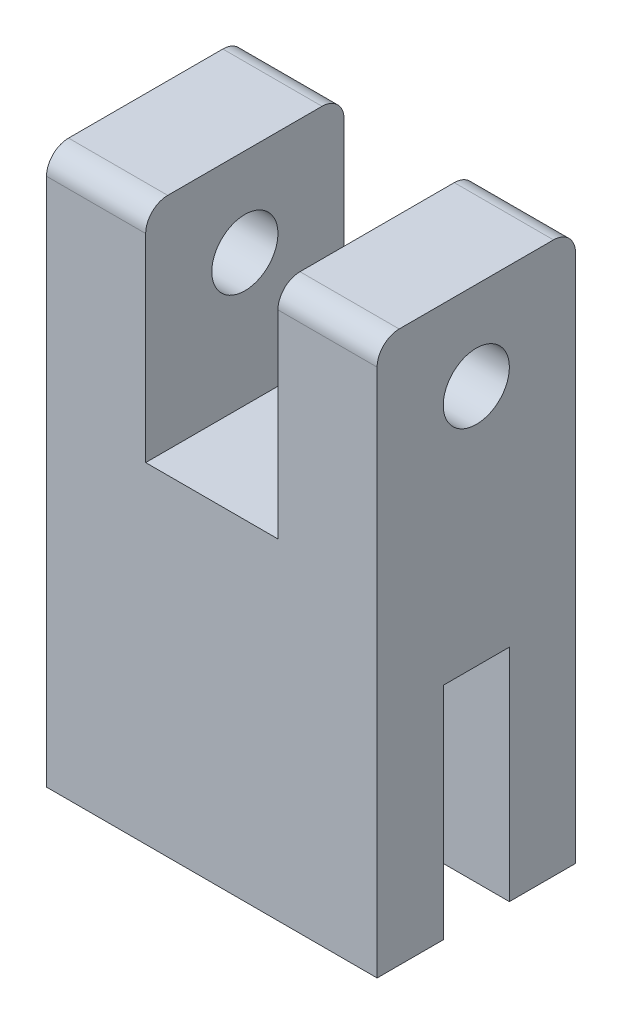
ISO-10303-21;
HEADER;
FILE_DESCRIPTION(('STEP AP214'),'2;1');
FILE_NAME('part.step','',(''),(''),'','','');
FILE_SCHEMA(('AUTOMOTIVE_DESIGN { 1 0 10303 214 1 1 1 1 }'));
ENDSEC;
DATA;
#1=APPLICATION_CONTEXT('core data for automotive mechanical design processes');
#2=APPLICATION_PROTOCOL_DEFINITION('international standard','automotive_design',2000,#1);
#3=PRODUCT_CONTEXT('',#1,'mechanical');
#4=PRODUCT('Part','Part','',(#3));
#5=PRODUCT_RELATED_PRODUCT_CATEGORY('part','',(#4));
#6=PRODUCT_DEFINITION_FORMATION('','',#4);
#7=PRODUCT_DEFINITION_CONTEXT('part definition',#1,'design');
#8=PRODUCT_DEFINITION('design','',#6,#7);
#9=PRODUCT_DEFINITION_SHAPE('','',#8);
#10=(LENGTH_UNIT() NAMED_UNIT(*) SI_UNIT(.MILLI.,.METRE.));
#11=(NAMED_UNIT(*) PLANE_ANGLE_UNIT() SI_UNIT($,.RADIAN.));
#12=(NAMED_UNIT(*) SI_UNIT($,.STERADIAN.) SOLID_ANGLE_UNIT());
#13=UNCERTAINTY_MEASURE_WITH_UNIT(LENGTH_MEASURE(1.E-05),#10,'distance_accuracy_value','');
#14=(GEOMETRIC_REPRESENTATION_CONTEXT(3) GLOBAL_UNCERTAINTY_ASSIGNED_CONTEXT((#13)) GLOBAL_UNIT_ASSIGNED_CONTEXT((#10,
#11,#12)) REPRESENTATION_CONTEXT('',''));
#15=CARTESIAN_POINT('',(0.,0.,0.));
#16=DIRECTION('',(0.,0.,1.));
#17=DIRECTION('',(1.,0.,0.));
#18=AXIS2_PLACEMENT_3D('',#15,#16,#17);
#19=CARTESIAN_POINT('',(-7.5,7.5,4.5));
#20=DIRECTION('',(0.,-1.,0.));
#21=DIRECTION('',(0.,0.,-1.));
#22=AXIS2_PLACEMENT_3D('',#19,#20,#21);
#23=PLANE('',#22);
#24=DIRECTION('',(0.,0.,-1.));
#25=VECTOR('',#24,1.);
#26=CARTESIAN_POINT('',(-3.,7.5,-4.5));
#27=LINE('',#26,#25);
#28=CARTESIAN_POINT('',(-3.,7.5,4.5));
#29=VERTEX_POINT('',#28);
#30=CARTESIAN_POINT('',(-3.,7.5,-4.5));
#31=VERTEX_POINT('',#30);
#32=EDGE_CURVE('E193',#29,#31,#27,.T.);
#33=ORIENTED_EDGE('',*,*,#32,.F.);
#34=DIRECTION('',(-1.,0.,0.));
#35=VECTOR('',#34,1.);
#36=CARTESIAN_POINT('',(-7.5,7.5,4.5));
#37=LINE('',#36,#35);
#38=CARTESIAN_POINT('',(3.,7.5,4.5));
#39=VERTEX_POINT('',#38);
#40=EDGE_CURVE('E177',#39,#29,#37,.T.);
#41=ORIENTED_EDGE('',*,*,#40,.F.);
#42=DIRECTION('',(0.,0.,1.));
#43=VECTOR('',#42,1.);
#44=CARTESIAN_POINT('',(3.,7.5,-4.5));
#45=LINE('',#44,#43);
#46=CARTESIAN_POINT('',(3.,7.5,-4.5));
#47=VERTEX_POINT('',#46);
#48=EDGE_CURVE('E190',#47,#39,#45,.T.);
#49=ORIENTED_EDGE('',*,*,#48,.F.);
#50=DIRECTION('',(-1.,0.,0.));
#51=VECTOR('',#50,1.);
#52=CARTESIAN_POINT('',(-7.5,7.5,-4.5));
#53=LINE('',#52,#51);
#54=EDGE_CURVE('E262',#47,#31,#53,.T.);
#55=ORIENTED_EDGE('',*,*,#54,.T.);
#56=EDGE_LOOP('',(#33,#41,#49,#55));
#57=FACE_BOUND('',#56,.T.);
#58=ADVANCED_FACE('F33',(#57),#23,.F.);
#59=CARTESIAN_POINT('',(-7.5,-7.5,4.5));
#60=DIRECTION('',(0.,1.,0.));
#61=DIRECTION('',(0.,0.,1.));
#62=AXIS2_PLACEMENT_3D('',#59,#60,#61);
#63=PLANE('',#62);
#64=DIRECTION('',(1.,0.,0.));
#65=VECTOR('',#64,1.);
#66=CARTESIAN_POINT('',(-7.5,-7.5,-1.5));
#67=LINE('',#66,#65);
#68=CARTESIAN_POINT('',(1.5,-7.5,-1.5));
#69=VERTEX_POINT('',#68);
#70=CARTESIAN_POINT('',(7.5,-7.5,-1.5));
#71=VERTEX_POINT('',#70);
#72=EDGE_CURVE('E232',#69,#71,#67,.T.);
#73=ORIENTED_EDGE('',*,*,#72,.F.);
#74=DIRECTION('',(0.,0.,1.));
#75=VECTOR('',#74,1.);
#76=CARTESIAN_POINT('',(1.5,-7.5,-4.5));
#77=LINE('',#76,#75);
#78=CARTESIAN_POINT('',(1.5,-7.5,-4.5));
#79=VERTEX_POINT('',#78);
#80=EDGE_CURVE('E224',#79,#69,#77,.T.);
#81=ORIENTED_EDGE('',*,*,#80,.F.);
#82=DIRECTION('',(1.,0.,0.));
#83=VECTOR('',#82,1.);
#84=CARTESIAN_POINT('',(-7.5,-7.5,-4.5));
#85=LINE('',#84,#83);
#86=CARTESIAN_POINT('',(7.5,-7.5,-4.5));
#87=VERTEX_POINT('',#86);
#88=EDGE_CURVE('E266',#79,#87,#85,.T.);
#89=ORIENTED_EDGE('',*,*,#88,.T.);
#90=DIRECTION('',(0.,0.,-1.));
#91=VECTOR('',#90,1.);
#92=CARTESIAN_POINT('',(7.5,-7.5,4.5));
#93=LINE('',#92,#91);
#94=EDGE_CURVE('E194',#71,#87,#93,.T.);
#95=ORIENTED_EDGE('',*,*,#94,.F.);
#96=EDGE_LOOP('',(#73,#81,#89,#95));
#97=FACE_BOUND('',#96,.T.);
#98=ADVANCED_FACE('F409',(#97),#63,.F.);
#99=CARTESIAN_POINT('',(-7.5,7.5,4.5));
#100=DIRECTION('',(1.,0.,0.));
#101=DIRECTION('',(0.,0.,-1.));
#102=AXIS2_PLACEMENT_3D('',#99,#100,#101);
#103=PLANE('',#102);
#104=CARTESIAN_POINT('',(-7.5,13.5,0.));
#105=DIRECTION('',(1.,0.,0.));
#106=DIRECTION('',(0.,0.,-1.));
#107=AXIS2_PLACEMENT_3D('',#104,#105,#106);
#108=CIRCLE('',#107,1.5);
#109=CARTESIAN_POINT('',(-7.5,13.5,-1.5));
#110=VERTEX_POINT('',#109);
#111=EDGE_CURVE('E293',#110,#110,#108,.T.);
#112=ORIENTED_EDGE('',*,*,#111,.T.);
#113=EDGE_LOOP('',(#112));
#114=FACE_BOUND('',#113,.T.);
#115=DIRECTION('',(0.,-1.,0.));
#116=VECTOR('',#115,1.);
#117=CARTESIAN_POINT('',(-7.5,7.5,4.5));
#118=LINE('',#117,#116);
#119=CARTESIAN_POINT('',(-7.5,16.5,4.5));
#120=VERTEX_POINT('',#119);
#121=CARTESIAN_POINT('',(-7.5,-7.5,4.5));
#122=VERTEX_POINT('',#121);
#123=EDGE_CURVE('E259',#120,#122,#118,.T.);
#124=ORIENTED_EDGE('',*,*,#123,.F.);
#125=CARTESIAN_POINT('',(-7.5,16.5,3.5));
#126=DIRECTION('',(1.,0.,0.));
#127=DIRECTION('',(0.,0.,-1.));
#128=AXIS2_PLACEMENT_3D('',#125,#126,#127);
#129=CIRCLE('',#128,1.);
#130=CARTESIAN_POINT('',(-7.5,17.5,3.5));
#131=VERTEX_POINT('',#130);
#132=EDGE_CURVE('E11',#120,#131,#129,.F.);
#133=ORIENTED_EDGE('',*,*,#132,.T.);
#134=DIRECTION('',(0.,0.,1.));
#135=VECTOR('',#134,1.);
#136=CARTESIAN_POINT('',(-7.5,17.5,-4.5));
#137=LINE('',#136,#135);
#138=CARTESIAN_POINT('',(-7.5,17.5,-3.5));
#139=VERTEX_POINT('',#138);
#140=EDGE_CURVE('E328',#139,#131,#137,.T.);
#141=ORIENTED_EDGE('',*,*,#140,.F.);
#142=CARTESIAN_POINT('',(-7.5,16.5,-3.5));
#143=DIRECTION('',(1.,0.,0.));
#144=DIRECTION('',(0.,0.,-1.));
#145=AXIS2_PLACEMENT_3D('',#142,#143,#144);
#146=CIRCLE('',#145,1.);
#147=CARTESIAN_POINT('',(-7.5,16.5,-4.5));
#148=VERTEX_POINT('',#147);
#149=EDGE_CURVE('E41',#139,#148,#146,.F.);
#150=ORIENTED_EDGE('',*,*,#149,.T.);
#151=DIRECTION('',(0.,-1.,0.));
#152=VECTOR('',#151,1.);
#153=CARTESIAN_POINT('',(-7.5,7.5,-4.5));
#154=LINE('',#153,#152);
#155=CARTESIAN_POINT('',(-7.5,-7.5,-4.5));
#156=VERTEX_POINT('',#155);
#157=EDGE_CURVE('E256',#148,#156,#154,.T.);
#158=ORIENTED_EDGE('',*,*,#157,.T.);
#159=DIRECTION('',(0.,0.,-1.));
#160=VECTOR('',#159,1.);
#161=CARTESIAN_POINT('',(-7.5,-7.5,4.5));
#162=LINE('',#161,#160);
#163=CARTESIAN_POINT('',(-7.5,-7.5,-1.5));
#164=VERTEX_POINT('',#163);
#165=EDGE_CURVE('E277',#164,#156,#162,.T.);
#166=ORIENTED_EDGE('',*,*,#165,.F.);
#167=DIRECTION('',(0.,-1.,0.));
#168=VECTOR('',#167,1.);
#169=CARTESIAN_POINT('',(-7.5,2.5,-1.5));
#170=LINE('',#169,#168);
#171=CARTESIAN_POINT('',(-7.5,2.5,-1.5));
#172=VERTEX_POINT('',#171);
#173=EDGE_CURVE('E230',#172,#164,#170,.T.);
#174=ORIENTED_EDGE('',*,*,#173,.F.);
#175=DIRECTION('',(0.,0.,1.));
#176=VECTOR('',#175,1.);
#177=CARTESIAN_POINT('',(-7.5,2.5,-1.5));
#178=LINE('',#177,#176);
#179=CARTESIAN_POINT('',(-7.5,2.5,1.5));
#180=VERTEX_POINT('',#179);
#181=EDGE_CURVE('E253',#172,#180,#178,.T.);
#182=ORIENTED_EDGE('',*,*,#181,.T.);
#183=DIRECTION('',(0.,-1.,0.));
#184=VECTOR('',#183,1.);
#185=CARTESIAN_POINT('',(-7.5,2.5,1.5));
#186=LINE('',#185,#184);
#187=CARTESIAN_POINT('',(-7.5,-7.5,1.5));
#188=VERTEX_POINT('',#187);
#189=EDGE_CURVE('E223',#180,#188,#186,.T.);
#190=ORIENTED_EDGE('',*,*,#189,.T.);
#191=EDGE_CURVE('E278',#122,#188,#162,.T.);
#192=ORIENTED_EDGE('',*,*,#191,.F.);
#193=EDGE_LOOP('',(#124,#133,#141,#150,#158,#166,#174,#182,#190,#192));
#194=FACE_BOUND('',#193,.T.);
#195=ADVANCED_FACE('F324',(#114,#194),#103,.F.);
#196=CARTESIAN_POINT('',(-1.5,-7.5,-4.5));
#197=VERTEX_POINT('',#196);
#198=EDGE_CURVE('E267',#156,#197,#85,.T.);
#199=ORIENTED_EDGE('',*,*,#198,.T.);
#200=DIRECTION('',(0.,0.,1.));
#201=VECTOR('',#200,1.);
#202=CARTESIAN_POINT('',(-1.5,-7.5,-4.5));
#203=LINE('',#202,#201);
#204=CARTESIAN_POINT('',(-1.5,-7.5,-1.5));
#205=VERTEX_POINT('',#204);
#206=EDGE_CURVE('E226',#197,#205,#203,.T.);
#207=ORIENTED_EDGE('',*,*,#206,.T.);
#208=EDGE_CURVE('E234',#164,#205,#67,.T.);
#209=ORIENTED_EDGE('',*,*,#208,.F.);
#210=ORIENTED_EDGE('',*,*,#165,.T.);
#211=EDGE_LOOP('',(#199,#207,#209,#210));
#212=FACE_BOUND('',#211,.T.);
#213=ADVANCED_FACE('F360',(#212),#63,.F.);
#214=CARTESIAN_POINT('',(7.5,7.5,4.5));
#215=DIRECTION('',(-1.,0.,0.));
#216=DIRECTION('',(0.,0.,1.));
#217=AXIS2_PLACEMENT_3D('',#214,#215,#216);
#218=PLANE('',#217);
#219=CARTESIAN_POINT('',(7.5,13.5,0.));
#220=DIRECTION('',(1.,0.,0.));
#221=DIRECTION('',(0.,0.,-1.));
#222=AXIS2_PLACEMENT_3D('',#219,#220,#221);
#223=CIRCLE('',#222,1.5);
#224=CARTESIAN_POINT('',(7.5,13.5,-1.5));
#225=VERTEX_POINT('',#224);
#226=EDGE_CURVE('E349',#225,#225,#223,.T.);
#227=ORIENTED_EDGE('',*,*,#226,.F.);
#228=EDGE_LOOP('',(#227));
#229=FACE_BOUND('',#228,.T.);
#230=DIRECTION('',(0.,1.,0.));
#231=VECTOR('',#230,1.);
#232=CARTESIAN_POINT('',(7.5,7.5,-4.5));
#233=LINE('',#232,#231);
#234=CARTESIAN_POINT('',(7.5,16.5,-4.5));
#235=VERTEX_POINT('',#234);
#236=EDGE_CURVE('E270',#87,#235,#233,.T.);
#237=ORIENTED_EDGE('',*,*,#236,.T.);
#238=CARTESIAN_POINT('',(7.5,16.5,-3.5));
#239=DIRECTION('',(-1.,0.,0.));
#240=DIRECTION('',(0.,0.,1.));
#241=AXIS2_PLACEMENT_3D('',#238,#239,#240);
#242=CIRCLE('',#241,1.);
#243=CARTESIAN_POINT('',(7.5,17.5,-3.5));
#244=VERTEX_POINT('',#243);
#245=EDGE_CURVE('E309',#235,#244,#242,.F.);
#246=ORIENTED_EDGE('',*,*,#245,.T.);
#247=DIRECTION('',(0.,0.,-1.));
#248=VECTOR('',#247,1.);
#249=CARTESIAN_POINT('',(7.5,17.5,4.5));
#250=LINE('',#249,#248);
#251=CARTESIAN_POINT('',(7.5,17.5,3.5));
#252=VERTEX_POINT('',#251);
#253=EDGE_CURVE('E200',#252,#244,#250,.T.);
#254=ORIENTED_EDGE('',*,*,#253,.F.);
#255=CARTESIAN_POINT('',(7.5,16.5,3.5));
#256=DIRECTION('',(-1.,0.,0.));
#257=DIRECTION('',(0.,0.,1.));
#258=AXIS2_PLACEMENT_3D('',#255,#256,#257);
#259=CIRCLE('',#258,1.);
#260=CARTESIAN_POINT('',(7.5,16.5,4.5));
#261=VERTEX_POINT('',#260);
#262=EDGE_CURVE('E307',#252,#261,#259,.F.);
#263=ORIENTED_EDGE('',*,*,#262,.T.);
#264=DIRECTION('',(0.,1.,0.));
#265=VECTOR('',#264,1.);
#266=CARTESIAN_POINT('',(7.5,7.5,4.5));
#267=LINE('',#266,#265);
#268=CARTESIAN_POINT('',(7.5,-7.5,4.5));
#269=VERTEX_POINT('',#268);
#270=EDGE_CURVE('E195',#269,#261,#267,.T.);
#271=ORIENTED_EDGE('',*,*,#270,.F.);
#272=CARTESIAN_POINT('',(7.5,-7.5,1.5));
#273=VERTEX_POINT('',#272);
#274=EDGE_CURVE('E274',#269,#273,#93,.T.);
#275=ORIENTED_EDGE('',*,*,#274,.T.);
#276=DIRECTION('',(0.,1.,0.));
#277=VECTOR('',#276,1.);
#278=CARTESIAN_POINT('',(7.5,2.5,1.5));
#279=LINE('',#278,#277);
#280=CARTESIAN_POINT('',(7.5,2.5,1.5));
#281=VERTEX_POINT('',#280);
#282=EDGE_CURVE('E248',#273,#281,#279,.T.);
#283=ORIENTED_EDGE('',*,*,#282,.T.);
#284=DIRECTION('',(0.,0.,1.));
#285=VECTOR('',#284,1.);
#286=CARTESIAN_POINT('',(7.5,2.5,-1.5));
#287=LINE('',#286,#285);
#288=CARTESIAN_POINT('',(7.5,2.5,-1.5));
#289=VERTEX_POINT('',#288);
#290=EDGE_CURVE('E242',#289,#281,#287,.T.);
#291=ORIENTED_EDGE('',*,*,#290,.F.);
#292=DIRECTION('',(0.,1.,0.));
#293=VECTOR('',#292,1.);
#294=CARTESIAN_POINT('',(7.5,2.5,-1.5));
#295=LINE('',#294,#293);
#296=EDGE_CURVE('E237',#71,#289,#295,.T.);
#297=ORIENTED_EDGE('',*,*,#296,.F.);
#298=ORIENTED_EDGE('',*,*,#94,.T.);
#299=EDGE_LOOP('',(#237,#246,#254,#263,#271,#275,#283,#291,#297,#298));
#300=FACE_BOUND('',#299,.T.);
#301=ADVANCED_FACE('F356',(#229,#300),#218,.F.);
#302=ORIENTED_EDGE('',*,*,#191,.T.);
#303=DIRECTION('',(1.,0.,0.));
#304=VECTOR('',#303,1.);
#305=CARTESIAN_POINT('',(-7.5,-7.5,1.5));
#306=LINE('',#305,#304);
#307=EDGE_CURVE('E245',#188,#273,#306,.T.);
#308=ORIENTED_EDGE('',*,*,#307,.T.);
#309=ORIENTED_EDGE('',*,*,#274,.F.);
#310=DIRECTION('',(1.,0.,0.));
#311=VECTOR('',#310,1.);
#312=CARTESIAN_POINT('',(-7.5,-7.5,4.5));
#313=LINE('',#312,#311);
#314=EDGE_CURVE('E261',#122,#269,#313,.T.);
#315=ORIENTED_EDGE('',*,*,#314,.F.);
#316=EDGE_LOOP('',(#302,#308,#309,#315));
#317=FACE_BOUND('',#316,.T.);
#318=ADVANCED_FACE('F359',(#317),#63,.F.);
#319=CARTESIAN_POINT('',(0.,0.,4.5));
#320=DIRECTION('',(0.,0.,1.));
#321=DIRECTION('',(1.,0.,0.));
#322=AXIS2_PLACEMENT_3D('',#319,#320,#321);
#323=PLANE('',#322);
#324=ORIENTED_EDGE('',*,*,#270,.T.);
#325=DIRECTION('',(1.,0.,0.));
#326=VECTOR('',#325,1.);
#327=CARTESIAN_POINT('',(0.,16.5,4.5));
#328=LINE('',#327,#326);
#329=CARTESIAN_POINT('',(3.,16.5,4.5));
#330=VERTEX_POINT('',#329);
#331=EDGE_CURVE('E179',#261,#330,#328,.F.);
#332=ORIENTED_EDGE('',*,*,#331,.T.);
#333=DIRECTION('',(0.,-1.,0.));
#334=VECTOR('',#333,1.);
#335=CARTESIAN_POINT('',(3.,17.5,4.5));
#336=LINE('',#335,#334);
#337=EDGE_CURVE('E172',#330,#39,#336,.T.);
#338=ORIENTED_EDGE('',*,*,#337,.T.);
#339=ORIENTED_EDGE('',*,*,#40,.T.);
#340=DIRECTION('',(0.,-1.,0.));
#341=VECTOR('',#340,1.);
#342=CARTESIAN_POINT('',(-3.,17.5,4.5));
#343=LINE('',#342,#341);
#344=CARTESIAN_POINT('',(-3.,16.5,4.5));
#345=VERTEX_POINT('',#344);
#346=EDGE_CURVE('E201',#345,#29,#343,.T.);
#347=ORIENTED_EDGE('',*,*,#346,.F.);
#348=DIRECTION('',(1.,0.,0.));
#349=VECTOR('',#348,1.);
#350=CARTESIAN_POINT('',(0.,16.5,4.5));
#351=LINE('',#350,#349);
#352=EDGE_CURVE('E311',#345,#120,#351,.F.);
#353=ORIENTED_EDGE('',*,*,#352,.T.);
#354=ORIENTED_EDGE('',*,*,#123,.T.);
#355=ORIENTED_EDGE('',*,*,#314,.T.);
#356=EDGE_LOOP('',(#324,#332,#338,#339,#347,#353,#354,#355));
#357=FACE_BOUND('',#356,.T.);
#358=ADVANCED_FACE('F175',(#357),#323,.T.);
#359=CARTESIAN_POINT('',(0.,0.,-4.5));
#360=DIRECTION('',(0.,0.,1.));
#361=DIRECTION('',(1.,0.,0.));
#362=AXIS2_PLACEMENT_3D('',#359,#360,#361);
#363=PLANE('',#362);
#364=DIRECTION('',(0.,-1.,0.));
#365=VECTOR('',#364,1.);
#366=CARTESIAN_POINT('',(3.,17.5,-4.5));
#367=LINE('',#366,#365);
#368=CARTESIAN_POINT('',(3.,16.5,-4.5));
#369=VERTEX_POINT('',#368);
#370=EDGE_CURVE('E183',#369,#47,#367,.T.);
#371=ORIENTED_EDGE('',*,*,#370,.F.);
#372=DIRECTION('',(-1.,0.,0.));
#373=VECTOR('',#372,1.);
#374=CARTESIAN_POINT('',(7.5,16.5,-4.5));
#375=LINE('',#374,#373);
#376=EDGE_CURVE('E305',#369,#235,#375,.F.);
#377=ORIENTED_EDGE('',*,*,#376,.T.);
#378=ORIENTED_EDGE('',*,*,#236,.F.);
#379=ORIENTED_EDGE('',*,*,#88,.F.);
#380=DIRECTION('',(0.,1.,0.));
#381=VECTOR('',#380,1.);
#382=CARTESIAN_POINT('',(1.5,0.,-4.5));
#383=LINE('',#382,#381);
#384=CARTESIAN_POINT('',(1.5,0.,-4.5));
#385=VERTEX_POINT('',#384);
#386=EDGE_CURVE('E216',#79,#385,#383,.T.);
#387=ORIENTED_EDGE('',*,*,#386,.T.);
#388=CARTESIAN_POINT('',(0.,0.,-4.5));
#389=DIRECTION('',(0.,0.,1.));
#390=DIRECTION('',(1.,0.,0.));
#391=AXIS2_PLACEMENT_3D('',#388,#389,#390);
#392=CIRCLE('',#391,1.5);
#393=CARTESIAN_POINT('',(-1.5,0.,-4.5));
#394=VERTEX_POINT('',#393);
#395=EDGE_CURVE('E210',#385,#394,#392,.T.);
#396=ORIENTED_EDGE('',*,*,#395,.T.);
#397=DIRECTION('',(0.,-1.,0.));
#398=VECTOR('',#397,1.);
#399=CARTESIAN_POINT('',(-1.5,0.,-4.5));
#400=LINE('',#399,#398);
#401=EDGE_CURVE('E213',#394,#197,#400,.T.);
#402=ORIENTED_EDGE('',*,*,#401,.T.);
#403=ORIENTED_EDGE('',*,*,#198,.F.);
#404=ORIENTED_EDGE('',*,*,#157,.F.);
#405=DIRECTION('',(-1.,0.,0.));
#406=VECTOR('',#405,1.);
#407=CARTESIAN_POINT('',(-3.,16.5,-4.5));
#408=LINE('',#407,#406);
#409=CARTESIAN_POINT('',(-3.,16.5,-4.5));
#410=VERTEX_POINT('',#409);
#411=EDGE_CURVE('E303',#148,#410,#408,.F.);
#412=ORIENTED_EDGE('',*,*,#411,.T.);
#413=DIRECTION('',(0.,-1.,0.));
#414=VECTOR('',#413,1.);
#415=CARTESIAN_POINT('',(-3.,17.5,-4.5));
#416=LINE('',#415,#414);
#417=EDGE_CURVE('E205',#410,#31,#416,.T.);
#418=ORIENTED_EDGE('',*,*,#417,.T.);
#419=ORIENTED_EDGE('',*,*,#54,.F.);
#420=EDGE_LOOP('',(#371,#377,#378,#379,#387,#396,#402,#403,#404,#412,#418,#419));
#421=FACE_BOUND('',#420,.T.);
#422=ADVANCED_FACE('F334',(#421),#363,.F.);
#423=CARTESIAN_POINT('',(-7.5,2.5,-1.5));
#424=DIRECTION('',(0.,1.,0.));
#425=DIRECTION('',(0.,0.,1.));
#426=AXIS2_PLACEMENT_3D('',#423,#424,#425);
#427=PLANE('',#426);
#428=DIRECTION('',(-1.,0.,0.));
#429=VECTOR('',#428,1.);
#430=CARTESIAN_POINT('',(-7.5,2.5,1.5));
#431=LINE('',#430,#429);
#432=EDGE_CURVE('E233',#281,#180,#431,.T.);
#433=ORIENTED_EDGE('',*,*,#432,.T.);
#434=ORIENTED_EDGE('',*,*,#181,.F.);
#435=DIRECTION('',(-1.,0.,0.));
#436=VECTOR('',#435,1.);
#437=CARTESIAN_POINT('',(-7.5,2.5,-1.5));
#438=LINE('',#437,#436);
#439=EDGE_CURVE('E239',#289,#172,#438,.T.);
#440=ORIENTED_EDGE('',*,*,#439,.F.);
#441=ORIENTED_EDGE('',*,*,#290,.T.);
#442=EDGE_LOOP('',(#433,#434,#440,#441));
#443=FACE_BOUND('',#442,.T.);
#444=ADVANCED_FACE('F389',(#443),#427,.F.);
#445=CARTESIAN_POINT('',(0.,0.,-1.5));
#446=DIRECTION('',(0.,0.,1.));
#447=DIRECTION('',(1.,0.,0.));
#448=AXIS2_PLACEMENT_3D('',#445,#446,#447);
#449=PLANE('',#448);
#450=DIRECTION('',(0.,1.,0.));
#451=VECTOR('',#450,1.);
#452=CARTESIAN_POINT('',(1.5,0.,-1.5));
#453=LINE('',#452,#451);
#454=CARTESIAN_POINT('',(1.5,0.,-1.5));
#455=VERTEX_POINT('',#454);
#456=EDGE_CURVE('E286',#69,#455,#453,.T.);
#457=ORIENTED_EDGE('',*,*,#456,.F.);
#458=ORIENTED_EDGE('',*,*,#72,.T.);
#459=ORIENTED_EDGE('',*,*,#296,.T.);
#460=ORIENTED_EDGE('',*,*,#439,.T.);
#461=ORIENTED_EDGE('',*,*,#173,.T.);
#462=ORIENTED_EDGE('',*,*,#208,.T.);
#463=DIRECTION('',(0.,-1.,0.));
#464=VECTOR('',#463,1.);
#465=CARTESIAN_POINT('',(-1.5,0.,-1.5));
#466=LINE('',#465,#464);
#467=CARTESIAN_POINT('',(-1.5,0.,-1.5));
#468=VERTEX_POINT('',#467);
#469=EDGE_CURVE('E281',#468,#205,#466,.T.);
#470=ORIENTED_EDGE('',*,*,#469,.F.);
#471=CARTESIAN_POINT('',(0.,0.,-1.5));
#472=DIRECTION('',(0.,0.,1.));
#473=DIRECTION('',(1.,0.,0.));
#474=AXIS2_PLACEMENT_3D('',#471,#472,#473);
#475=CIRCLE('',#474,1.5);
#476=EDGE_CURVE('E283',#455,#468,#475,.T.);
#477=ORIENTED_EDGE('',*,*,#476,.F.);
#478=EDGE_LOOP('',(#457,#458,#459,#460,#461,#462,#470,#477));
#479=FACE_BOUND('',#478,.T.);
#480=ADVANCED_FACE('F393',(#479),#449,.T.);
#481=CARTESIAN_POINT('',(0.,0.,1.5));
#482=DIRECTION('',(0.,0.,1.));
#483=DIRECTION('',(1.,0.,0.));
#484=AXIS2_PLACEMENT_3D('',#481,#482,#483);
#485=PLANE('',#484);
#486=ORIENTED_EDGE('',*,*,#189,.F.);
#487=ORIENTED_EDGE('',*,*,#432,.F.);
#488=ORIENTED_EDGE('',*,*,#282,.F.);
#489=ORIENTED_EDGE('',*,*,#307,.F.);
#490=EDGE_LOOP('',(#486,#487,#488,#489));
#491=FACE_BOUND('',#490,.T.);
#492=ADVANCED_FACE('F386',(#491),#485,.F.);
#493=CARTESIAN_POINT('',(0.,0.,-4.5));
#494=DIRECTION('',(0.,0.,1.));
#495=DIRECTION('',(1.,0.,0.));
#496=AXIS2_PLACEMENT_3D('',#493,#494,#495);
#497=CYLINDRICAL_SURFACE('',#496,1.5);
#498=ORIENTED_EDGE('',*,*,#476,.T.);
#499=DIRECTION('',(0.,0.,1.));
#500=VECTOR('',#499,1.);
#501=CARTESIAN_POINT('',(-1.5,0.,-4.5));
#502=LINE('',#501,#500);
#503=EDGE_CURVE('E219',#394,#468,#502,.T.);
#504=ORIENTED_EDGE('',*,*,#503,.F.);
#505=ORIENTED_EDGE('',*,*,#395,.F.);
#506=DIRECTION('',(0.,0.,1.));
#507=VECTOR('',#506,1.);
#508=CARTESIAN_POINT('',(1.5,0.,-4.5));
#509=LINE('',#508,#507);
#510=EDGE_CURVE('E220',#385,#455,#509,.T.);
#511=ORIENTED_EDGE('',*,*,#510,.T.);
#512=EDGE_LOOP('',(#498,#504,#505,#511));
#513=FACE_BOUND('',#512,.T.);
#514=ADVANCED_FACE('F403',(#513),#497,.F.);
#515=CARTESIAN_POINT('',(1.5,0.,-4.5));
#516=DIRECTION('',(1.,0.,0.));
#517=DIRECTION('',(0.,1.,0.));
#518=AXIS2_PLACEMENT_3D('',#515,#516,#517);
#519=PLANE('',#518);
#520=ORIENTED_EDGE('',*,*,#456,.T.);
#521=ORIENTED_EDGE('',*,*,#510,.F.);
#522=ORIENTED_EDGE('',*,*,#386,.F.);
#523=ORIENTED_EDGE('',*,*,#80,.T.);
#524=EDGE_LOOP('',(#520,#521,#522,#523));
#525=FACE_BOUND('',#524,.T.);
#526=ADVANCED_FACE('F405',(#525),#519,.F.);
#527=CARTESIAN_POINT('',(-1.5,0.,-4.5));
#528=DIRECTION('',(-1.,0.,0.));
#529=DIRECTION('',(0.,-1.,0.));
#530=AXIS2_PLACEMENT_3D('',#527,#528,#529);
#531=PLANE('',#530);
#532=ORIENTED_EDGE('',*,*,#469,.T.);
#533=ORIENTED_EDGE('',*,*,#206,.F.);
#534=ORIENTED_EDGE('',*,*,#401,.F.);
#535=ORIENTED_EDGE('',*,*,#503,.T.);
#536=EDGE_LOOP('',(#532,#533,#534,#535));
#537=FACE_BOUND('',#536,.T.);
#538=ADVANCED_FACE('F399',(#537),#531,.F.);
#539=CARTESIAN_POINT('',(3.,17.5,-4.5));
#540=DIRECTION('',(1.,0.,0.));
#541=DIRECTION('',(0.,0.,-1.));
#542=AXIS2_PLACEMENT_3D('',#539,#540,#541);
#543=PLANE('',#542);
#544=CARTESIAN_POINT('',(3.,13.5,0.));
#545=DIRECTION('',(1.,0.,0.));
#546=DIRECTION('',(0.,0.,-1.));
#547=AXIS2_PLACEMENT_3D('',#544,#545,#546);
#548=CIRCLE('',#547,1.5);
#549=CARTESIAN_POINT('',(3.,13.5,-1.5));
#550=VERTEX_POINT('',#549);
#551=EDGE_CURVE('E292',#550,#550,#548,.T.);
#552=ORIENTED_EDGE('',*,*,#551,.T.);
#553=EDGE_LOOP('',(#552));
#554=FACE_BOUND('',#553,.T.);
#555=DIRECTION('',(0.,0.,1.));
#556=VECTOR('',#555,1.);
#557=CARTESIAN_POINT('',(3.,17.5,-4.5));
#558=LINE('',#557,#556);
#559=CARTESIAN_POINT('',(3.,17.5,-3.5));
#560=VERTEX_POINT('',#559);
#561=CARTESIAN_POINT('',(3.,17.5,3.5));
#562=VERTEX_POINT('',#561);
#563=EDGE_CURVE('E184',#560,#562,#558,.T.);
#564=ORIENTED_EDGE('',*,*,#563,.F.);
#565=CARTESIAN_POINT('',(3.,16.5,-3.5));
#566=DIRECTION('',(1.,0.,0.));
#567=DIRECTION('',(0.,0.,-1.));
#568=AXIS2_PLACEMENT_3D('',#565,#566,#567);
#569=CIRCLE('',#568,1.);
#570=EDGE_CURVE('E301',#560,#369,#569,.F.);
#571=ORIENTED_EDGE('',*,*,#570,.T.);
#572=ORIENTED_EDGE('',*,*,#370,.T.);
#573=ORIENTED_EDGE('',*,*,#48,.T.);
#574=ORIENTED_EDGE('',*,*,#337,.F.);
#575=CARTESIAN_POINT('',(3.,16.5,3.5));
#576=DIRECTION('',(1.,0.,0.));
#577=DIRECTION('',(0.,0.,-1.));
#578=AXIS2_PLACEMENT_3D('',#575,#576,#577);
#579=CIRCLE('',#578,1.);
#580=EDGE_CURVE('E299',#330,#562,#579,.F.);
#581=ORIENTED_EDGE('',*,*,#580,.T.);
#582=EDGE_LOOP('',(#564,#571,#572,#573,#574,#581));
#583=FACE_BOUND('',#582,.T.);
#584=ADVANCED_FACE('F198',(#554,#583),#543,.F.);
#585=CARTESIAN_POINT('',(0.,17.5,0.));
#586=DIRECTION('',(0.,1.,0.));
#587=DIRECTION('',(0.,0.,1.));
#588=AXIS2_PLACEMENT_3D('',#585,#586,#587);
#589=PLANE('',#588);
#590=ORIENTED_EDGE('',*,*,#253,.T.);
#591=DIRECTION('',(-1.,0.,0.));
#592=VECTOR('',#591,1.);
#593=CARTESIAN_POINT('',(3.,17.5,-3.5));
#594=LINE('',#593,#592);
#595=EDGE_CURVE('E296',#244,#560,#594,.T.);
#596=ORIENTED_EDGE('',*,*,#595,.T.);
#597=ORIENTED_EDGE('',*,*,#563,.T.);
#598=DIRECTION('',(1.,0.,0.));
#599=VECTOR('',#598,1.);
#600=CARTESIAN_POINT('',(0.,17.5,3.5));
#601=LINE('',#600,#599);
#602=EDGE_CURVE('E288',#562,#252,#601,.T.);
#603=ORIENTED_EDGE('',*,*,#602,.T.);
#604=EDGE_LOOP('',(#590,#596,#597,#603));
#605=FACE_BOUND('',#604,.T.);
#606=ADVANCED_FACE('F375',(#605),#589,.T.);
#607=CARTESIAN_POINT('',(-3.,17.5,-4.5));
#608=DIRECTION('',(-1.,0.,0.));
#609=DIRECTION('',(0.,0.,1.));
#610=AXIS2_PLACEMENT_3D('',#607,#608,#609);
#611=PLANE('',#610);
#612=CARTESIAN_POINT('',(-3.,13.5,0.));
#613=DIRECTION('',(-1.,0.,0.));
#614=DIRECTION('',(0.,0.,1.));
#615=AXIS2_PLACEMENT_3D('',#612,#613,#614);
#616=CIRCLE('',#615,1.5);
#617=CARTESIAN_POINT('',(-3.,13.5,1.5));
#618=VERTEX_POINT('',#617);
#619=EDGE_CURVE('E289',#618,#618,#616,.T.);
#620=ORIENTED_EDGE('',*,*,#619,.T.);
#621=EDGE_LOOP('',(#620));
#622=FACE_BOUND('',#621,.T.);
#623=DIRECTION('',(0.,0.,-1.));
#624=VECTOR('',#623,1.);
#625=CARTESIAN_POINT('',(-3.,17.5,-4.5));
#626=LINE('',#625,#624);
#627=CARTESIAN_POINT('',(-3.,17.5,3.5));
#628=VERTEX_POINT('',#627);
#629=CARTESIAN_POINT('',(-3.,17.5,-3.5));
#630=VERTEX_POINT('',#629);
#631=EDGE_CURVE('E337',#628,#630,#626,.T.);
#632=ORIENTED_EDGE('',*,*,#631,.F.);
#633=CARTESIAN_POINT('',(-3.,16.5,3.5));
#634=DIRECTION('',(-1.,0.,0.));
#635=DIRECTION('',(0.,0.,1.));
#636=AXIS2_PLACEMENT_3D('',#633,#634,#635);
#637=CIRCLE('',#636,1.);
#638=EDGE_CURVE('E56',#628,#345,#637,.F.);
#639=ORIENTED_EDGE('',*,*,#638,.T.);
#640=ORIENTED_EDGE('',*,*,#346,.T.);
#641=ORIENTED_EDGE('',*,*,#32,.T.);
#642=ORIENTED_EDGE('',*,*,#417,.F.);
#643=CARTESIAN_POINT('',(-3.,16.5,-3.5));
#644=DIRECTION('',(-1.,0.,0.));
#645=DIRECTION('',(0.,0.,1.));
#646=AXIS2_PLACEMENT_3D('',#643,#644,#645);
#647=CIRCLE('',#646,1.);
#648=EDGE_CURVE('E48',#410,#630,#647,.F.);
#649=ORIENTED_EDGE('',*,*,#648,.T.);
#650=EDGE_LOOP('',(#632,#639,#640,#641,#642,#649));
#651=FACE_BOUND('',#650,.T.);
#652=ADVANCED_FACE('F446',(#622,#651),#611,.F.);
#653=CARTESIAN_POINT('',(0.,17.5,0.));
#654=DIRECTION('',(0.,1.,0.));
#655=DIRECTION('',(0.,0.,1.));
#656=AXIS2_PLACEMENT_3D('',#653,#654,#655);
#657=PLANE('',#656);
#658=ORIENTED_EDGE('',*,*,#140,.T.);
#659=DIRECTION('',(1.,0.,0.));
#660=VECTOR('',#659,1.);
#661=CARTESIAN_POINT('',(0.,17.5,3.5));
#662=LINE('',#661,#660);
#663=EDGE_CURVE('E317',#131,#628,#662,.T.);
#664=ORIENTED_EDGE('',*,*,#663,.T.);
#665=ORIENTED_EDGE('',*,*,#631,.T.);
#666=DIRECTION('',(-1.,0.,0.));
#667=VECTOR('',#666,1.);
#668=CARTESIAN_POINT('',(-7.5,17.5,-3.5));
#669=LINE('',#668,#667);
#670=EDGE_CURVE('E314',#630,#139,#669,.T.);
#671=ORIENTED_EDGE('',*,*,#670,.T.);
#672=EDGE_LOOP('',(#658,#664,#665,#671));
#673=FACE_BOUND('',#672,.T.);
#674=ADVANCED_FACE('F336',(#673),#657,.T.);
#675=CARTESIAN_POINT('',(-7.5,13.5,0.));
#676=DIRECTION('',(1.,0.,0.));
#677=DIRECTION('',(0.,0.,-1.));
#678=AXIS2_PLACEMENT_3D('',#675,#676,#677);
#679=CYLINDRICAL_SURFACE('',#678,1.5);
#680=ORIENTED_EDGE('',*,*,#111,.F.);
#681=EDGE_LOOP('',(#680));
#682=FACE_BOUND('',#681,.T.);
#683=ORIENTED_EDGE('',*,*,#619,.F.);
#684=EDGE_LOOP('',(#683));
#685=FACE_BOUND('',#684,.T.);
#686=ADVANCED_FACE('F452',(#682,#685),#679,.F.);
#687=ORIENTED_EDGE('',*,*,#226,.T.);
#688=EDGE_LOOP('',(#687));
#689=FACE_BOUND('',#688,.T.);
#690=ORIENTED_EDGE('',*,*,#551,.F.);
#691=EDGE_LOOP('',(#690));
#692=FACE_BOUND('',#691,.T.);
#693=ADVANCED_FACE('F353',(#689,#692),#679,.F.);
#694=CARTESIAN_POINT('',(0.,16.5,-3.5));
#695=DIRECTION('',(1.,0.,0.));
#696=DIRECTION('',(0.,0.,-1.));
#697=AXIS2_PLACEMENT_3D('',#694,#695,#696);
#698=CYLINDRICAL_SURFACE('',#697,1.);
#699=ORIENTED_EDGE('',*,*,#245,.F.);
#700=ORIENTED_EDGE('',*,*,#376,.F.);
#701=ORIENTED_EDGE('',*,*,#570,.F.);
#702=ORIENTED_EDGE('',*,*,#595,.F.);
#703=EDGE_LOOP('',(#699,#700,#701,#702));
#704=FACE_BOUND('',#703,.T.);
#705=ADVANCED_FACE('F372',(#704),#698,.T.);
#706=CARTESIAN_POINT('',(0.,16.5,3.5));
#707=DIRECTION('',(1.,0.,0.));
#708=DIRECTION('',(0.,0.,-1.));
#709=AXIS2_PLACEMENT_3D('',#706,#707,#708);
#710=CYLINDRICAL_SURFACE('',#709,1.);
#711=ORIENTED_EDGE('',*,*,#580,.F.);
#712=ORIENTED_EDGE('',*,*,#331,.F.);
#713=ORIENTED_EDGE('',*,*,#262,.F.);
#714=ORIENTED_EDGE('',*,*,#602,.F.);
#715=EDGE_LOOP('',(#711,#712,#713,#714));
#716=FACE_BOUND('',#715,.T.);
#717=ADVANCED_FACE('F378',(#716),#710,.T.);
#718=CARTESIAN_POINT('',(0.,16.5,3.5));
#719=DIRECTION('',(1.,0.,0.));
#720=DIRECTION('',(0.,0.,-1.));
#721=AXIS2_PLACEMENT_3D('',#718,#719,#720);
#722=CYLINDRICAL_SURFACE('',#721,1.);
#723=ORIENTED_EDGE('',*,*,#132,.F.);
#724=ORIENTED_EDGE('',*,*,#352,.F.);
#725=ORIENTED_EDGE('',*,*,#638,.F.);
#726=ORIENTED_EDGE('',*,*,#663,.F.);
#727=EDGE_LOOP('',(#723,#724,#725,#726));
#728=FACE_BOUND('',#727,.T.);
#729=ADVANCED_FACE('F553',(#728),#722,.T.);
#730=CARTESIAN_POINT('',(0.,16.5,-3.5));
#731=DIRECTION('',(1.,0.,0.));
#732=DIRECTION('',(0.,0.,-1.));
#733=AXIS2_PLACEMENT_3D('',#730,#731,#732);
#734=CYLINDRICAL_SURFACE('',#733,1.);
#735=ORIENTED_EDGE('',*,*,#648,.F.);
#736=ORIENTED_EDGE('',*,*,#411,.F.);
#737=ORIENTED_EDGE('',*,*,#149,.F.);
#738=ORIENTED_EDGE('',*,*,#670,.F.);
#739=EDGE_LOOP('',(#735,#736,#737,#738));
#740=FACE_BOUND('',#739,.T.);
#741=ADVANCED_FACE('F35',(#740),#734,.T.);
#742=CLOSED_SHELL('',(#58,#98,#195,#213,#301,#318,#358,#422,#444,#480,#492,#514,#526,#538,#584,
#606,#652,#674,#686,#693,#705,#717,#729,#741));
#743=MANIFOLD_SOLID_BREP('B2',#742);
#744=ADVANCED_BREP_SHAPE_REPRESENTATION('',(#18,#743),#14);
#745=SHAPE_DEFINITION_REPRESENTATION(#9,#744);
ENDSEC;
END-ISO-10303-21;
